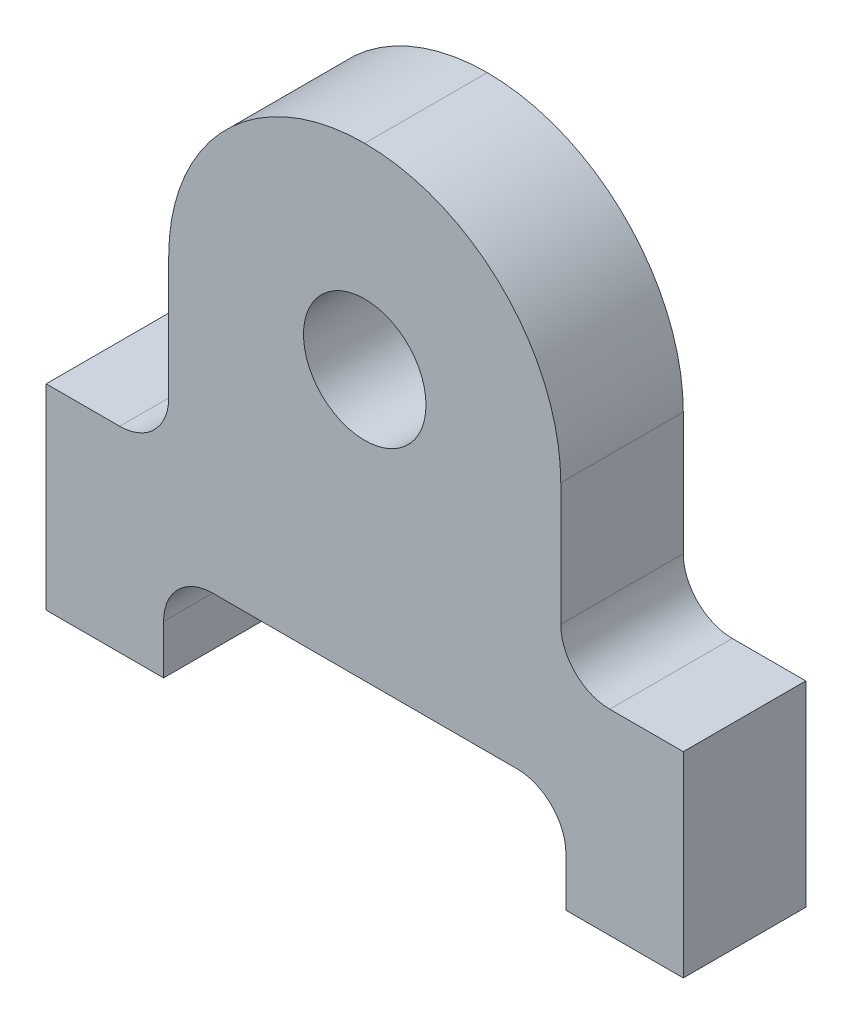
ISO-10303-21;
HEADER;
FILE_DESCRIPTION(('STEP AP214'),'2;1');
FILE_NAME('part.step','',(''),(''),'','','');
FILE_SCHEMA(('AUTOMOTIVE_DESIGN { 1 0 10303 214 1 1 1 1 }'));
ENDSEC;
DATA;
#1=APPLICATION_CONTEXT('core data for automotive mechanical design processes');
#2=APPLICATION_PROTOCOL_DEFINITION('international standard','automotive_design',2000,#1);
#3=PRODUCT_CONTEXT('',#1,'mechanical');
#4=PRODUCT('Part','Part','',(#3));
#5=PRODUCT_RELATED_PRODUCT_CATEGORY('part','',(#4));
#6=PRODUCT_DEFINITION_FORMATION('','',#4);
#7=PRODUCT_DEFINITION_CONTEXT('part definition',#1,'design');
#8=PRODUCT_DEFINITION('design','',#6,#7);
#9=PRODUCT_DEFINITION_SHAPE('','',#8);
#10=(LENGTH_UNIT() NAMED_UNIT(*) SI_UNIT(.MILLI.,.METRE.));
#11=(NAMED_UNIT(*) PLANE_ANGLE_UNIT() SI_UNIT($,.RADIAN.));
#12=(NAMED_UNIT(*) SI_UNIT($,.STERADIAN.) SOLID_ANGLE_UNIT());
#13=UNCERTAINTY_MEASURE_WITH_UNIT(LENGTH_MEASURE(1.E-05),#10,'distance_accuracy_value','');
#14=(GEOMETRIC_REPRESENTATION_CONTEXT(3) GLOBAL_UNCERTAINTY_ASSIGNED_CONTEXT((#13)) GLOBAL_UNIT_ASSIGNED_CONTEXT((#10,
#11,#12)) REPRESENTATION_CONTEXT('',''));
#15=CARTESIAN_POINT('',(0.,0.,0.));
#16=DIRECTION('',(0.,0.,1.));
#17=DIRECTION('',(1.,0.,0.));
#18=AXIS2_PLACEMENT_3D('',#15,#16,#17);
#19=CARTESIAN_POINT('',(16.51,-14.605,6.35));
#20=DIRECTION('',(0.,1.,0.));
#21=DIRECTION('',(0.,0.,1.));
#22=AXIS2_PLACEMENT_3D('',#19,#20,#21);
#23=PLANE('',#22);
#24=DIRECTION('',(1.,0.,0.));
#25=VECTOR('',#24,1.);
#26=CARTESIAN_POINT('',(16.51,-14.605,0.));
#27=LINE('',#26,#25);
#28=CARTESIAN_POINT('',(-16.51,-14.605,0.));
#29=VERTEX_POINT('',#28);
#30=CARTESIAN_POINT('',(-10.4267,-14.605,0.));
#31=VERTEX_POINT('',#30);
#32=EDGE_CURVE('E198',#29,#31,#27,.T.);
#33=ORIENTED_EDGE('',*,*,#32,.T.);
#34=DIRECTION('',(0.,0.,1.));
#35=VECTOR('',#34,1.);
#36=CARTESIAN_POINT('',(-10.4267,-14.605,-0.00100000000000013));
#37=LINE('',#36,#35);
#38=CARTESIAN_POINT('',(-10.4267,-14.605,6.35));
#39=VERTEX_POINT('',#38);
#40=EDGE_CURVE('E261',#31,#39,#37,.T.);
#41=ORIENTED_EDGE('',*,*,#40,.T.);
#42=DIRECTION('',(1.,0.,0.));
#43=VECTOR('',#42,1.);
#44=CARTESIAN_POINT('',(16.51,-14.605,6.35));
#45=LINE('',#44,#43);
#46=CARTESIAN_POINT('',(-16.51,-14.605,6.35));
#47=VERTEX_POINT('',#46);
#48=EDGE_CURVE('E186',#47,#39,#45,.T.);
#49=ORIENTED_EDGE('',*,*,#48,.F.);
#50=DIRECTION('',(0.,0.,-1.));
#51=VECTOR('',#50,1.);
#52=CARTESIAN_POINT('',(-16.51,-14.605,6.35));
#53=LINE('',#52,#51);
#54=EDGE_CURVE('E188',#47,#29,#53,.T.);
#55=ORIENTED_EDGE('',*,*,#54,.T.);
#56=EDGE_LOOP('',(#33,#41,#49,#55));
#57=FACE_BOUND('',#56,.T.);
#58=ADVANCED_FACE('F37',(#57),#23,.F.);
#59=CARTESIAN_POINT('',(-16.51,-14.605,6.35));
#60=DIRECTION('',(1.,0.,0.));
#61=DIRECTION('',(0.,0.,-1.));
#62=AXIS2_PLACEMENT_3D('',#59,#60,#61);
#63=PLANE('',#62);
#64=DIRECTION('',(0.,-1.,0.));
#65=VECTOR('',#64,1.);
#66=CARTESIAN_POINT('',(-16.51,-14.605,6.35));
#67=LINE('',#66,#65);
#68=CARTESIAN_POINT('',(-16.51,-4.44499999999999,6.35));
#69=VERTEX_POINT('',#68);
#70=EDGE_CURVE('E201',#69,#47,#67,.T.);
#71=ORIENTED_EDGE('',*,*,#70,.F.);
#72=DIRECTION('',(0.,0.,1.));
#73=VECTOR('',#72,1.);
#74=CARTESIAN_POINT('',(-16.51,-4.44499999999999,-0.00100000000000013));
#75=LINE('',#74,#73);
#76=CARTESIAN_POINT('',(-16.51,-4.44499999999999,0.));
#77=VERTEX_POINT('',#76);
#78=EDGE_CURVE('E290',#77,#69,#75,.T.);
#79=ORIENTED_EDGE('',*,*,#78,.F.);
#80=DIRECTION('',(0.,-1.,0.));
#81=VECTOR('',#80,1.);
#82=CARTESIAN_POINT('',(-16.51,-14.605,0.));
#83=LINE('',#82,#81);
#84=EDGE_CURVE('E194',#77,#29,#83,.T.);
#85=ORIENTED_EDGE('',*,*,#84,.T.);
#86=ORIENTED_EDGE('',*,*,#54,.F.);
#87=EDGE_LOOP('',(#71,#79,#85,#86));
#88=FACE_BOUND('',#87,.T.);
#89=ADVANCED_FACE('F299',(#88),#63,.F.);
#90=CARTESIAN_POINT('',(10.4267,-14.605,6.35));
#91=VERTEX_POINT('',#90);
#92=CARTESIAN_POINT('',(16.51,-14.605,6.35));
#93=VERTEX_POINT('',#92);
#94=EDGE_CURVE('E183',#91,#93,#45,.T.);
#95=ORIENTED_EDGE('',*,*,#94,.F.);
#96=DIRECTION('',(0.,0.,1.));
#97=VECTOR('',#96,1.);
#98=CARTESIAN_POINT('',(10.4267,-14.605,-0.00100000000000013));
#99=LINE('',#98,#97);
#100=CARTESIAN_POINT('',(10.4267,-14.605,0.));
#101=VERTEX_POINT('',#100);
#102=EDGE_CURVE('E278',#101,#91,#99,.T.);
#103=ORIENTED_EDGE('',*,*,#102,.F.);
#104=CARTESIAN_POINT('',(16.51,-14.605,0.));
#105=VERTEX_POINT('',#104);
#106=EDGE_CURVE('E196',#101,#105,#27,.T.);
#107=ORIENTED_EDGE('',*,*,#106,.T.);
#108=DIRECTION('',(0.,0.,-1.));
#109=VECTOR('',#108,1.);
#110=CARTESIAN_POINT('',(16.51,-14.605,6.35));
#111=LINE('',#110,#109);
#112=EDGE_CURVE('E185',#93,#105,#111,.T.);
#113=ORIENTED_EDGE('',*,*,#112,.F.);
#114=EDGE_LOOP('',(#95,#103,#107,#113));
#115=FACE_BOUND('',#114,.T.);
#116=ADVANCED_FACE('F322',(#115),#23,.F.);
#117=CARTESIAN_POINT('',(16.51,-14.605,6.35));
#118=DIRECTION('',(-1.,0.,0.));
#119=DIRECTION('',(0.,0.,1.));
#120=AXIS2_PLACEMENT_3D('',#117,#118,#119);
#121=PLANE('',#120);
#122=DIRECTION('',(0.,1.,0.));
#123=VECTOR('',#122,1.);
#124=CARTESIAN_POINT('',(16.51,-14.605,0.));
#125=LINE('',#124,#123);
#126=CARTESIAN_POINT('',(16.51,-4.445,0.));
#127=VERTEX_POINT('',#126);
#128=EDGE_CURVE('E175',#105,#127,#125,.T.);
#129=ORIENTED_EDGE('',*,*,#128,.T.);
#130=DIRECTION('',(0.,0.,1.));
#131=VECTOR('',#130,1.);
#132=CARTESIAN_POINT('',(16.51,-4.44499999999999,-0.00100000000000013));
#133=LINE('',#132,#131);
#134=CARTESIAN_POINT('',(16.51,-4.44499999999999,6.35));
#135=VERTEX_POINT('',#134);
#136=EDGE_CURVE('E160',#127,#135,#133,.T.);
#137=ORIENTED_EDGE('',*,*,#136,.T.);
#138=DIRECTION('',(0.,1.,0.));
#139=VECTOR('',#138,1.);
#140=CARTESIAN_POINT('',(16.51,-14.605,6.35));
#141=LINE('',#140,#139);
#142=EDGE_CURVE('E173',#93,#135,#141,.T.);
#143=ORIENTED_EDGE('',*,*,#142,.F.);
#144=ORIENTED_EDGE('',*,*,#112,.T.);
#145=EDGE_LOOP('',(#129,#137,#143,#144));
#146=FACE_BOUND('',#145,.T.);
#147=ADVANCED_FACE('F171',(#146),#121,.F.);
#148=CARTESIAN_POINT('',(0.,0.,6.35));
#149=DIRECTION('',(0.,0.,1.));
#150=DIRECTION('',(1.,0.,0.));
#151=AXIS2_PLACEMENT_3D('',#148,#149,#150);
#152=PLANE('',#151);
#153=DIRECTION('',(0.,-1.,0.));
#154=VECTOR('',#153,1.);
#155=CARTESIAN_POINT('',(10.16,14.605,6.35));
#156=LINE('',#155,#154);
#157=CARTESIAN_POINT('',(10.16,4.445,6.35));
#158=VERTEX_POINT('',#157);
#159=CARTESIAN_POINT('',(10.16,-1.905,6.35));
#160=VERTEX_POINT('',#159);
#161=EDGE_CURVE('E166',#158,#160,#156,.T.);
#162=ORIENTED_EDGE('',*,*,#161,.F.);
#163=CARTESIAN_POINT('',(0.,4.445,6.35));
#164=DIRECTION('',(0.,0.,1.));
#165=DIRECTION('',(1.,0.,0.));
#166=AXIS2_PLACEMENT_3D('',#163,#164,#165);
#167=CIRCLE('',#166,10.16);
#168=CARTESIAN_POINT('',(0.,14.605,6.35));
#169=VERTEX_POINT('',#168);
#170=EDGE_CURVE('E211',#158,#169,#167,.T.);
#171=ORIENTED_EDGE('',*,*,#170,.T.);
#172=CARTESIAN_POINT('',(0.,4.445,6.35));
#173=DIRECTION('',(0.,0.,1.));
#174=DIRECTION('',(1.,0.,0.));
#175=AXIS2_PLACEMENT_3D('',#172,#173,#174);
#176=CIRCLE('',#175,10.16);
#177=CARTESIAN_POINT('',(-10.16,4.445,6.35));
#178=VERTEX_POINT('',#177);
#179=EDGE_CURVE('E208',#169,#178,#176,.T.);
#180=ORIENTED_EDGE('',*,*,#179,.T.);
#181=DIRECTION('',(0.,1.,0.));
#182=VECTOR('',#181,1.);
#183=CARTESIAN_POINT('',(-10.16,14.605,6.35));
#184=LINE('',#183,#182);
#185=CARTESIAN_POINT('',(-10.16,-1.90499999999999,6.35));
#186=VERTEX_POINT('',#185);
#187=EDGE_CURVE('E288',#186,#178,#184,.T.);
#188=ORIENTED_EDGE('',*,*,#187,.F.);
#189=CARTESIAN_POINT('',(-12.7,-1.905,6.35));
#190=DIRECTION('',(0.,0.,1.));
#191=DIRECTION('',(1.,0.,0.));
#192=AXIS2_PLACEMENT_3D('',#189,#190,#191);
#193=CIRCLE('',#192,2.54);
#194=CARTESIAN_POINT('',(-12.7,-4.44499999999999,6.35));
#195=VERTEX_POINT('',#194);
#196=EDGE_CURVE('E245',#186,#195,#193,.F.);
#197=ORIENTED_EDGE('',*,*,#196,.T.);
#198=DIRECTION('',(1.,0.,0.));
#199=VECTOR('',#198,1.);
#200=CARTESIAN_POINT('',(-16.51,-4.44499999999999,6.35));
#201=LINE('',#200,#199);
#202=EDGE_CURVE('E285',#69,#195,#201,.T.);
#203=ORIENTED_EDGE('',*,*,#202,.F.);
#204=ORIENTED_EDGE('',*,*,#70,.T.);
#205=ORIENTED_EDGE('',*,*,#48,.T.);
#206=DIRECTION('',(0.,-1.,0.));
#207=VECTOR('',#206,1.);
#208=CARTESIAN_POINT('',(-10.4267,-9.525,6.35));
#209=LINE('',#208,#207);
#210=CARTESIAN_POINT('',(-10.4267,-12.065,6.35));
#211=VERTEX_POINT('',#210);
#212=EDGE_CURVE('E256',#211,#39,#209,.T.);
#213=ORIENTED_EDGE('',*,*,#212,.F.);
#214=CARTESIAN_POINT('',(-7.8867,-12.065,6.35));
#215=DIRECTION('',(0.,0.,1.));
#216=DIRECTION('',(1.,0.,0.));
#217=AXIS2_PLACEMENT_3D('',#214,#215,#216);
#218=CIRCLE('',#217,2.54);
#219=CARTESIAN_POINT('',(-7.8867,-9.525,6.35));
#220=VERTEX_POINT('',#219);
#221=EDGE_CURVE('E45',#211,#220,#218,.F.);
#222=ORIENTED_EDGE('',*,*,#221,.T.);
#223=DIRECTION('',(-1.,0.,0.));
#224=VECTOR('',#223,1.);
#225=CARTESIAN_POINT('',(-10.4267,-9.525,6.35));
#226=LINE('',#225,#224);
#227=CARTESIAN_POINT('',(7.8867,-9.525,6.35));
#228=VERTEX_POINT('',#227);
#229=EDGE_CURVE('E255',#228,#220,#226,.T.);
#230=ORIENTED_EDGE('',*,*,#229,.F.);
#231=CARTESIAN_POINT('',(7.8867,-12.065,6.35));
#232=DIRECTION('',(0.,0.,1.));
#233=DIRECTION('',(1.,0.,0.));
#234=AXIS2_PLACEMENT_3D('',#231,#232,#233);
#235=CIRCLE('',#234,2.54);
#236=CARTESIAN_POINT('',(10.4267,-12.065,6.35));
#237=VERTEX_POINT('',#236);
#238=EDGE_CURVE('E249',#228,#237,#235,.F.);
#239=ORIENTED_EDGE('',*,*,#238,.T.);
#240=DIRECTION('',(0.,1.,0.));
#241=VECTOR('',#240,1.);
#242=CARTESIAN_POINT('',(10.4267,-9.525,6.35));
#243=LINE('',#242,#241);
#244=EDGE_CURVE('E262',#91,#237,#243,.T.);
#245=ORIENTED_EDGE('',*,*,#244,.F.);
#246=ORIENTED_EDGE('',*,*,#94,.T.);
#247=ORIENTED_EDGE('',*,*,#142,.T.);
#248=DIRECTION('',(1.,0.,0.));
#249=VECTOR('',#248,1.);
#250=CARTESIAN_POINT('',(10.16,-4.44499999999999,6.35));
#251=LINE('',#250,#249);
#252=CARTESIAN_POINT('',(12.7,-4.44499999999999,6.35));
#253=VERTEX_POINT('',#252);
#254=EDGE_CURVE('E156',#253,#135,#251,.T.);
#255=ORIENTED_EDGE('',*,*,#254,.F.);
#256=CARTESIAN_POINT('',(12.7,-1.90499999999999,6.35));
#257=DIRECTION('',(0.,0.,1.));
#258=DIRECTION('',(1.,0.,0.));
#259=AXIS2_PLACEMENT_3D('',#256,#257,#258);
#260=CIRCLE('',#259,2.54);
#261=EDGE_CURVE('E241',#253,#160,#260,.F.);
#262=ORIENTED_EDGE('',*,*,#261,.T.);
#263=EDGE_LOOP('',(#162,#171,#180,#188,#197,#203,#204,#205,#213,#222,#230,#239,#245,#246,#247,
#255,#262));
#264=FACE_BOUND('',#263,.T.);
#265=CARTESIAN_POINT('',(0.,4.44500000000001,6.35));
#266=DIRECTION('',(0.,0.,1.));
#267=DIRECTION('',(1.,0.,0.));
#268=AXIS2_PLACEMENT_3D('',#265,#266,#267);
#269=CIRCLE('',#268,3.175);
#270=CARTESIAN_POINT('',(3.175,4.44500000000001,6.35));
#271=VERTEX_POINT('',#270);
#272=EDGE_CURVE('E223',#271,#271,#269,.T.);
#273=ORIENTED_EDGE('',*,*,#272,.F.);
#274=EDGE_LOOP('',(#273));
#275=FACE_BOUND('',#274,.T.);
#276=ADVANCED_FACE('F179',(#264,#275),#152,.T.);
#277=CARTESIAN_POINT('',(0.,0.,0.));
#278=DIRECTION('',(0.,0.,1.));
#279=DIRECTION('',(1.,0.,0.));
#280=AXIS2_PLACEMENT_3D('',#277,#278,#279);
#281=PLANE('',#280);
#282=CARTESIAN_POINT('',(0.,4.44500000000001,0.));
#283=DIRECTION('',(0.,0.,1.));
#284=DIRECTION('',(1.,0.,0.));
#285=AXIS2_PLACEMENT_3D('',#282,#283,#284);
#286=CIRCLE('',#285,3.175);
#287=CARTESIAN_POINT('',(3.175,4.44500000000001,0.));
#288=VERTEX_POINT('',#287);
#289=EDGE_CURVE('E338',#288,#288,#286,.F.);
#290=ORIENTED_EDGE('',*,*,#289,.F.);
#291=EDGE_LOOP('',(#290));
#292=FACE_BOUND('',#291,.T.);
#293=CARTESIAN_POINT('',(0.,4.445,0.));
#294=DIRECTION('',(0.,0.,1.));
#295=DIRECTION('',(1.,0.,0.));
#296=AXIS2_PLACEMENT_3D('',#293,#294,#295);
#297=CIRCLE('',#296,10.16);
#298=CARTESIAN_POINT('',(-10.16,4.445,0.));
#299=VERTEX_POINT('',#298);
#300=CARTESIAN_POINT('',(0.,14.605,0.));
#301=VERTEX_POINT('',#300);
#302=EDGE_CURVE('E213',#299,#301,#297,.F.);
#303=ORIENTED_EDGE('',*,*,#302,.T.);
#304=CARTESIAN_POINT('',(0.,4.445,0.));
#305=DIRECTION('',(0.,0.,1.));
#306=DIRECTION('',(1.,0.,0.));
#307=AXIS2_PLACEMENT_3D('',#304,#305,#306);
#308=CIRCLE('',#307,10.16);
#309=CARTESIAN_POINT('',(10.16,4.445,0.));
#310=VERTEX_POINT('',#309);
#311=EDGE_CURVE('E215',#301,#310,#308,.F.);
#312=ORIENTED_EDGE('',*,*,#311,.T.);
#313=DIRECTION('',(0.,1.,0.));
#314=VECTOR('',#313,1.);
#315=CARTESIAN_POINT('',(10.16,14.605,0.));
#316=LINE('',#315,#314);
#317=CARTESIAN_POINT('',(10.16,-1.905,0.));
#318=VERTEX_POINT('',#317);
#319=EDGE_CURVE('E280',#318,#310,#316,.T.);
#320=ORIENTED_EDGE('',*,*,#319,.F.);
#321=CARTESIAN_POINT('',(12.7,-1.90499999999999,0.));
#322=DIRECTION('',(0.,0.,1.));
#323=DIRECTION('',(1.,0.,0.));
#324=AXIS2_PLACEMENT_3D('',#321,#322,#323);
#325=CIRCLE('',#324,2.54);
#326=CARTESIAN_POINT('',(12.7,-4.44499999999999,0.));
#327=VERTEX_POINT('',#326);
#328=EDGE_CURVE('E243',#318,#327,#325,.T.);
#329=ORIENTED_EDGE('',*,*,#328,.T.);
#330=DIRECTION('',(-1.,0.,0.));
#331=VECTOR('',#330,1.);
#332=CARTESIAN_POINT('',(10.16,-4.44499999999999,0.));
#333=LINE('',#332,#331);
#334=EDGE_CURVE('E176',#127,#327,#333,.T.);
#335=ORIENTED_EDGE('',*,*,#334,.F.);
#336=ORIENTED_EDGE('',*,*,#128,.F.);
#337=ORIENTED_EDGE('',*,*,#106,.F.);
#338=DIRECTION('',(0.,-1.,0.));
#339=VECTOR('',#338,1.);
#340=CARTESIAN_POINT('',(10.4267,-9.525,0.));
#341=LINE('',#340,#339);
#342=CARTESIAN_POINT('',(10.4267,-12.065,0.));
#343=VERTEX_POINT('',#342);
#344=EDGE_CURVE('E272',#343,#101,#341,.T.);
#345=ORIENTED_EDGE('',*,*,#344,.F.);
#346=CARTESIAN_POINT('',(7.8867,-12.065,0.));
#347=DIRECTION('',(0.,0.,1.));
#348=DIRECTION('',(1.,0.,0.));
#349=AXIS2_PLACEMENT_3D('',#346,#347,#348);
#350=CIRCLE('',#349,2.54);
#351=CARTESIAN_POINT('',(7.8867,-9.525,0.));
#352=VERTEX_POINT('',#351);
#353=EDGE_CURVE('E251',#343,#352,#350,.T.);
#354=ORIENTED_EDGE('',*,*,#353,.T.);
#355=DIRECTION('',(1.,0.,0.));
#356=VECTOR('',#355,1.);
#357=CARTESIAN_POINT('',(-10.4267,-9.525,0.));
#358=LINE('',#357,#356);
#359=CARTESIAN_POINT('',(-7.8867,-9.525,0.));
#360=VERTEX_POINT('',#359);
#361=EDGE_CURVE('E269',#360,#352,#358,.T.);
#362=ORIENTED_EDGE('',*,*,#361,.F.);
#363=CARTESIAN_POINT('',(-7.8867,-12.065,0.));
#364=DIRECTION('',(0.,0.,1.));
#365=DIRECTION('',(1.,0.,0.));
#366=AXIS2_PLACEMENT_3D('',#363,#364,#365);
#367=CIRCLE('',#366,2.54);
#368=CARTESIAN_POINT('',(-10.4267,-12.065,0.));
#369=VERTEX_POINT('',#368);
#370=EDGE_CURVE('E11',#360,#369,#367,.T.);
#371=ORIENTED_EDGE('',*,*,#370,.T.);
#372=DIRECTION('',(0.,1.,0.));
#373=VECTOR('',#372,1.);
#374=CARTESIAN_POINT('',(-10.4267,-9.525,0.));
#375=LINE('',#374,#373);
#376=EDGE_CURVE('E267',#31,#369,#375,.T.);
#377=ORIENTED_EDGE('',*,*,#376,.F.);
#378=ORIENTED_EDGE('',*,*,#32,.F.);
#379=ORIENTED_EDGE('',*,*,#84,.F.);
#380=DIRECTION('',(-1.,0.,0.));
#381=VECTOR('',#380,1.);
#382=CARTESIAN_POINT('',(-16.51,-4.44499999999999,0.));
#383=LINE('',#382,#381);
#384=CARTESIAN_POINT('',(-12.7,-4.44499999999999,0.));
#385=VERTEX_POINT('',#384);
#386=EDGE_CURVE('E197',#385,#77,#383,.T.);
#387=ORIENTED_EDGE('',*,*,#386,.F.);
#388=CARTESIAN_POINT('',(-12.7,-1.905,0.));
#389=DIRECTION('',(0.,0.,1.));
#390=DIRECTION('',(1.,0.,0.));
#391=AXIS2_PLACEMENT_3D('',#388,#389,#390);
#392=CIRCLE('',#391,2.54);
#393=CARTESIAN_POINT('',(-10.16,-1.905,0.));
#394=VERTEX_POINT('',#393);
#395=EDGE_CURVE('E247',#385,#394,#392,.T.);
#396=ORIENTED_EDGE('',*,*,#395,.T.);
#397=DIRECTION('',(0.,-1.,0.));
#398=VECTOR('',#397,1.);
#399=CARTESIAN_POINT('',(-10.16,14.605,0.));
#400=LINE('',#399,#398);
#401=EDGE_CURVE('E282',#299,#394,#400,.T.);
#402=ORIENTED_EDGE('',*,*,#401,.F.);
#403=EDGE_LOOP('',(#303,#312,#320,#329,#335,#336,#337,#345,#354,#362,#371,#377,#378,#379,#387,
#396,#402));
#404=FACE_BOUND('',#403,.T.);
#405=ADVANCED_FACE('F302',(#292,#404),#281,.F.);
#406=CARTESIAN_POINT('',(-10.16,14.605,-0.00100000000000013));
#407=DIRECTION('',(1.,0.,0.));
#408=DIRECTION('',(0.,0.,-1.));
#409=AXIS2_PLACEMENT_3D('',#406,#407,#408);
#410=PLANE('',#409);
#411=ORIENTED_EDGE('',*,*,#401,.T.);
#412=DIRECTION('',(0.,0.,1.));
#413=VECTOR('',#412,1.);
#414=CARTESIAN_POINT('',(-10.16,-1.905,6.35));
#415=LINE('',#414,#413);
#416=EDGE_CURVE('E227',#394,#186,#415,.T.);
#417=ORIENTED_EDGE('',*,*,#416,.T.);
#418=ORIENTED_EDGE('',*,*,#187,.T.);
#419=DIRECTION('',(0.,0.,1.));
#420=VECTOR('',#419,1.);
#421=CARTESIAN_POINT('',(-10.16,4.445,-0.00100000000000013));
#422=LINE('',#421,#420);
#423=EDGE_CURVE('E218',#178,#299,#422,.F.);
#424=ORIENTED_EDGE('',*,*,#423,.T.);
#425=EDGE_LOOP('',(#411,#417,#418,#424));
#426=FACE_BOUND('',#425,.T.);
#427=ADVANCED_FACE('F307',(#426),#410,.F.);
#428=CARTESIAN_POINT('',(-16.51,-4.44499999999999,-0.00100000000000013));
#429=DIRECTION('',(0.,-1.,0.));
#430=DIRECTION('',(0.,0.,-1.));
#431=AXIS2_PLACEMENT_3D('',#428,#429,#430);
#432=PLANE('',#431);
#433=ORIENTED_EDGE('',*,*,#202,.T.);
#434=DIRECTION('',(0.,0.,1.));
#435=VECTOR('',#434,1.);
#436=CARTESIAN_POINT('',(-12.7,-4.44499999999999,0.));
#437=LINE('',#436,#435);
#438=EDGE_CURVE('E230',#195,#385,#437,.F.);
#439=ORIENTED_EDGE('',*,*,#438,.T.);
#440=ORIENTED_EDGE('',*,*,#386,.T.);
#441=ORIENTED_EDGE('',*,*,#78,.T.);
#442=EDGE_LOOP('',(#433,#439,#440,#441));
#443=FACE_BOUND('',#442,.T.);
#444=ADVANCED_FACE('F314',(#443),#432,.F.);
#445=CARTESIAN_POINT('',(0.,4.44500000000001,-0.00100000000000013));
#446=DIRECTION('',(0.,0.,1.));
#447=DIRECTION('',(1.,0.,0.));
#448=AXIS2_PLACEMENT_3D('',#445,#446,#447);
#449=CYLINDRICAL_SURFACE('',#448,3.175);
#450=ORIENTED_EDGE('',*,*,#272,.T.);
#451=EDGE_LOOP('',(#450));
#452=FACE_BOUND('',#451,.T.);
#453=ORIENTED_EDGE('',*,*,#289,.T.);
#454=EDGE_LOOP('',(#453));
#455=FACE_BOUND('',#454,.T.);
#456=ADVANCED_FACE('F387',(#452,#455),#449,.F.);
#457=CARTESIAN_POINT('',(-10.4267,-9.525,-0.00100000000000013));
#458=DIRECTION('',(-1.,0.,0.));
#459=DIRECTION('',(0.,0.,1.));
#460=AXIS2_PLACEMENT_3D('',#457,#458,#459);
#461=PLANE('',#460);
#462=ORIENTED_EDGE('',*,*,#376,.T.);
#463=DIRECTION('',(0.,0.,1.));
#464=VECTOR('',#463,1.);
#465=CARTESIAN_POINT('',(-10.4267,-12.065,6.35));
#466=LINE('',#465,#464);
#467=EDGE_CURVE('E239',#369,#211,#466,.T.);
#468=ORIENTED_EDGE('',*,*,#467,.T.);
#469=ORIENTED_EDGE('',*,*,#212,.T.);
#470=ORIENTED_EDGE('',*,*,#40,.F.);
#471=EDGE_LOOP('',(#462,#468,#469,#470));
#472=FACE_BOUND('',#471,.T.);
#473=ADVANCED_FACE('F265',(#472),#461,.F.);
#474=CARTESIAN_POINT('',(-10.4267,-9.525,-0.00100000000000013));
#475=DIRECTION('',(0.,1.,0.));
#476=DIRECTION('',(0.,0.,1.));
#477=AXIS2_PLACEMENT_3D('',#474,#475,#476);
#478=PLANE('',#477);
#479=ORIENTED_EDGE('',*,*,#361,.T.);
#480=DIRECTION('',(0.,0.,1.));
#481=VECTOR('',#480,1.);
#482=CARTESIAN_POINT('',(7.8867,-9.525,6.35));
#483=LINE('',#482,#481);
#484=EDGE_CURVE('E234',#352,#228,#483,.T.);
#485=ORIENTED_EDGE('',*,*,#484,.T.);
#486=ORIENTED_EDGE('',*,*,#229,.T.);
#487=DIRECTION('',(0.,0.,1.));
#488=VECTOR('',#487,1.);
#489=CARTESIAN_POINT('',(-7.8867,-9.525,0.));
#490=LINE('',#489,#488);
#491=EDGE_CURVE('E232',#220,#360,#490,.F.);
#492=ORIENTED_EDGE('',*,*,#491,.T.);
#493=EDGE_LOOP('',(#479,#485,#486,#492));
#494=FACE_BOUND('',#493,.T.);
#495=ADVANCED_FACE('F259',(#494),#478,.F.);
#496=CARTESIAN_POINT('',(10.4267,-9.525,-0.00100000000000013));
#497=DIRECTION('',(1.,0.,0.));
#498=DIRECTION('',(0.,0.,-1.));
#499=AXIS2_PLACEMENT_3D('',#496,#497,#498);
#500=PLANE('',#499);
#501=ORIENTED_EDGE('',*,*,#244,.T.);
#502=DIRECTION('',(0.,0.,1.));
#503=VECTOR('',#502,1.);
#504=CARTESIAN_POINT('',(10.4267,-12.065,0.));
#505=LINE('',#504,#503);
#506=EDGE_CURVE('E237',#237,#343,#505,.F.);
#507=ORIENTED_EDGE('',*,*,#506,.T.);
#508=ORIENTED_EDGE('',*,*,#344,.T.);
#509=ORIENTED_EDGE('',*,*,#102,.T.);
#510=EDGE_LOOP('',(#501,#507,#508,#509));
#511=FACE_BOUND('',#510,.T.);
#512=ADVANCED_FACE('F376',(#511),#500,.F.);
#513=CARTESIAN_POINT('',(10.16,14.605,-0.00100000000000013));
#514=DIRECTION('',(-1.,0.,0.));
#515=DIRECTION('',(0.,0.,1.));
#516=AXIS2_PLACEMENT_3D('',#513,#514,#515);
#517=PLANE('',#516);
#518=ORIENTED_EDGE('',*,*,#161,.T.);
#519=DIRECTION('',(0.,0.,1.));
#520=VECTOR('',#519,1.);
#521=CARTESIAN_POINT('',(10.16,-1.90499999999999,0.));
#522=LINE('',#521,#520);
#523=EDGE_CURVE('E225',#160,#318,#522,.F.);
#524=ORIENTED_EDGE('',*,*,#523,.T.);
#525=ORIENTED_EDGE('',*,*,#319,.T.);
#526=DIRECTION('',(0.,0.,1.));
#527=VECTOR('',#526,1.);
#528=CARTESIAN_POINT('',(10.16,4.445,-0.00100000000000013));
#529=LINE('',#528,#527);
#530=EDGE_CURVE('E205',#310,#158,#529,.T.);
#531=ORIENTED_EDGE('',*,*,#530,.T.);
#532=EDGE_LOOP('',(#518,#524,#525,#531));
#533=FACE_BOUND('',#532,.T.);
#534=ADVANCED_FACE('F350',(#533),#517,.F.);
#535=CARTESIAN_POINT('',(10.16,-4.44499999999999,-0.00100000000000013));
#536=DIRECTION('',(0.,-1.,0.));
#537=DIRECTION('',(0.,0.,-1.));
#538=AXIS2_PLACEMENT_3D('',#535,#536,#537);
#539=PLANE('',#538);
#540=ORIENTED_EDGE('',*,*,#334,.T.);
#541=DIRECTION('',(0.,0.,1.));
#542=VECTOR('',#541,1.);
#543=CARTESIAN_POINT('',(12.7,-4.44499999999999,6.35));
#544=LINE('',#543,#542);
#545=EDGE_CURVE('E163',#327,#253,#544,.T.);
#546=ORIENTED_EDGE('',*,*,#545,.T.);
#547=ORIENTED_EDGE('',*,*,#254,.T.);
#548=ORIENTED_EDGE('',*,*,#136,.F.);
#549=EDGE_LOOP('',(#540,#546,#547,#548));
#550=FACE_BOUND('',#549,.T.);
#551=ADVANCED_FACE('F159',(#550),#539,.F.);
#552=CARTESIAN_POINT('',(0.,4.445,6.35));
#553=DIRECTION('',(0.,0.,1.));
#554=DIRECTION('',(1.,0.,0.));
#555=AXIS2_PLACEMENT_3D('',#552,#553,#554);
#556=CYLINDRICAL_SURFACE('',#555,10.16);
#557=DIRECTION('',(0.,0.,1.));
#558=VECTOR('',#557,1.);
#559=CARTESIAN_POINT('',(0.,14.605,6.35));
#560=LINE('',#559,#558);
#561=EDGE_CURVE('E220',#301,#169,#560,.T.);
#562=ORIENTED_EDGE('',*,*,#561,.F.);
#563=ORIENTED_EDGE('',*,*,#302,.F.);
#564=ORIENTED_EDGE('',*,*,#423,.F.);
#565=ORIENTED_EDGE('',*,*,#179,.F.);
#566=EDGE_LOOP('',(#562,#563,#564,#565));
#567=FACE_BOUND('',#566,.T.);
#568=ADVANCED_FACE('F365',(#567),#556,.T.);
#569=CARTESIAN_POINT('',(0.,4.445,-0.00100000000000013));
#570=DIRECTION('',(0.,0.,1.));
#571=DIRECTION('',(1.,0.,0.));
#572=AXIS2_PLACEMENT_3D('',#569,#570,#571);
#573=CYLINDRICAL_SURFACE('',#572,10.16);
#574=ORIENTED_EDGE('',*,*,#311,.F.);
#575=ORIENTED_EDGE('',*,*,#561,.T.);
#576=ORIENTED_EDGE('',*,*,#170,.F.);
#577=ORIENTED_EDGE('',*,*,#530,.F.);
#578=EDGE_LOOP('',(#574,#575,#576,#577));
#579=FACE_BOUND('',#578,.T.);
#580=ADVANCED_FACE('F356',(#579),#573,.T.);
#581=CARTESIAN_POINT('',(12.7,-1.90499999999999,-0.00100000000000013));
#582=DIRECTION('',(0.,0.,-1.));
#583=DIRECTION('',(-1.,0.,0.));
#584=AXIS2_PLACEMENT_3D('',#581,#582,#583);
#585=CYLINDRICAL_SURFACE('',#584,2.54);
#586=ORIENTED_EDGE('',*,*,#328,.F.);
#587=ORIENTED_EDGE('',*,*,#523,.F.);
#588=ORIENTED_EDGE('',*,*,#261,.F.);
#589=ORIENTED_EDGE('',*,*,#545,.F.);
#590=EDGE_LOOP('',(#586,#587,#588,#589));
#591=FACE_BOUND('',#590,.T.);
#592=ADVANCED_FACE('F353',(#591),#585,.F.);
#593=CARTESIAN_POINT('',(-12.7,-1.905,-0.00100000000000013));
#594=DIRECTION('',(0.,0.,-1.));
#595=DIRECTION('',(-1.,0.,0.));
#596=AXIS2_PLACEMENT_3D('',#593,#594,#595);
#597=CYLINDRICAL_SURFACE('',#596,2.54);
#598=ORIENTED_EDGE('',*,*,#395,.F.);
#599=ORIENTED_EDGE('',*,*,#438,.F.);
#600=ORIENTED_EDGE('',*,*,#196,.F.);
#601=ORIENTED_EDGE('',*,*,#416,.F.);
#602=EDGE_LOOP('',(#598,#599,#600,#601));
#603=FACE_BOUND('',#602,.T.);
#604=ADVANCED_FACE('F355',(#603),#597,.F.);
#605=CARTESIAN_POINT('',(7.8867,-12.065,-0.00100000000000013));
#606=DIRECTION('',(0.,0.,-1.));
#607=DIRECTION('',(-1.,0.,0.));
#608=AXIS2_PLACEMENT_3D('',#605,#606,#607);
#609=CYLINDRICAL_SURFACE('',#608,2.54);
#610=ORIENTED_EDGE('',*,*,#353,.F.);
#611=ORIENTED_EDGE('',*,*,#506,.F.);
#612=ORIENTED_EDGE('',*,*,#238,.F.);
#613=ORIENTED_EDGE('',*,*,#484,.F.);
#614=EDGE_LOOP('',(#610,#611,#612,#613));
#615=FACE_BOUND('',#614,.T.);
#616=ADVANCED_FACE('F362',(#615),#609,.F.);
#617=CARTESIAN_POINT('',(-7.8867,-12.065,-0.00100000000000013));
#618=DIRECTION('',(0.,0.,-1.));
#619=DIRECTION('',(-1.,0.,0.));
#620=AXIS2_PLACEMENT_3D('',#617,#618,#619);
#621=CYLINDRICAL_SURFACE('',#620,2.54);
#622=ORIENTED_EDGE('',*,*,#370,.F.);
#623=ORIENTED_EDGE('',*,*,#491,.F.);
#624=ORIENTED_EDGE('',*,*,#221,.F.);
#625=ORIENTED_EDGE('',*,*,#467,.F.);
#626=EDGE_LOOP('',(#622,#623,#624,#625));
#627=FACE_BOUND('',#626,.T.);
#628=ADVANCED_FACE('F39',(#627),#621,.F.);
#629=CLOSED_SHELL('',(#58,#89,#116,#147,#276,#405,#427,#444,#456,#473,#495,#512,#534,#551,#568,
#580,#592,#604,#616,#628));
#630=MANIFOLD_SOLID_BREP('B2',#629);
#631=ADVANCED_BREP_SHAPE_REPRESENTATION('',(#18,#630),#14);
#632=SHAPE_DEFINITION_REPRESENTATION(#9,#631);
ENDSEC;
END-ISO-10303-21;
